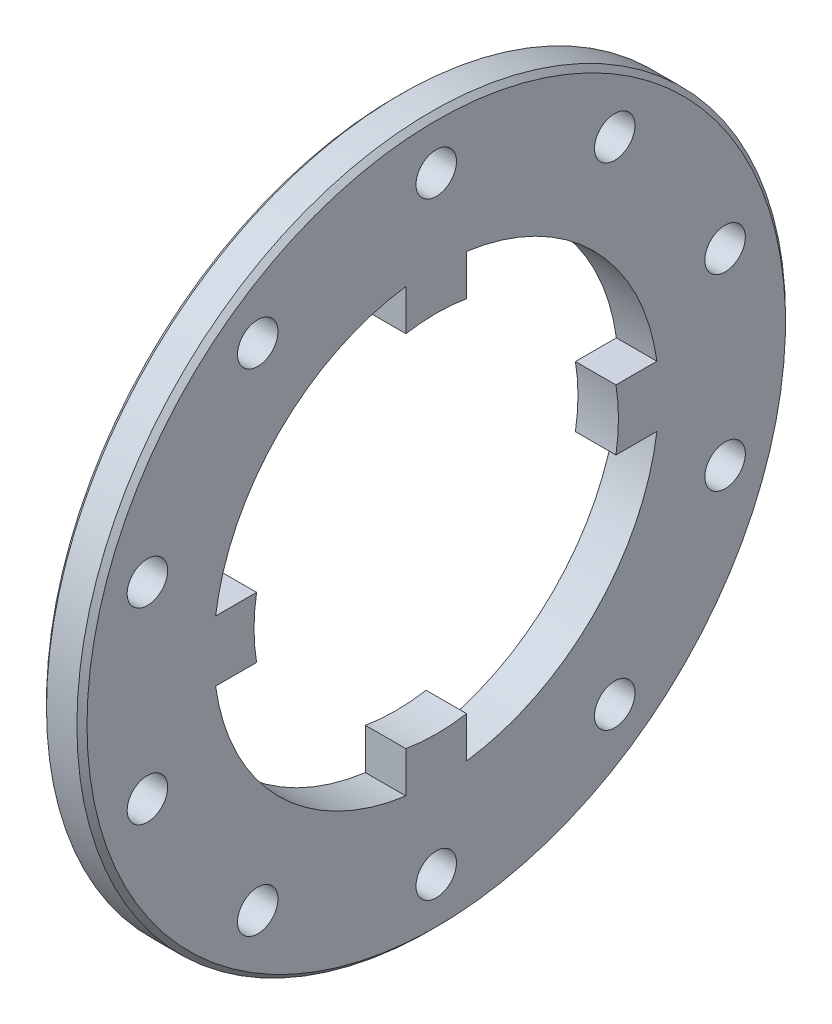
ISO-10303-21;
HEADER;
FILE_DESCRIPTION(('STEP AP214'),'2;1');
FILE_NAME('part.step','',(''),(''),'','','');
FILE_SCHEMA(('AUTOMOTIVE_DESIGN { 1 0 10303 214 1 1 1 1 }'));
ENDSEC;
DATA;
#1=APPLICATION_CONTEXT('core data for automotive mechanical design processes');
#2=APPLICATION_PROTOCOL_DEFINITION('international standard','automotive_design',2000,#1);
#3=PRODUCT_CONTEXT('',#1,'mechanical');
#4=PRODUCT('Part','Part','',(#3));
#5=PRODUCT_RELATED_PRODUCT_CATEGORY('part','',(#4));
#6=PRODUCT_DEFINITION_FORMATION('','',#4);
#7=PRODUCT_DEFINITION_CONTEXT('part definition',#1,'design');
#8=PRODUCT_DEFINITION('design','',#6,#7);
#9=PRODUCT_DEFINITION_SHAPE('','',#8);
#10=(LENGTH_UNIT() NAMED_UNIT(*) SI_UNIT(.MILLI.,.METRE.));
#11=(NAMED_UNIT(*) PLANE_ANGLE_UNIT() SI_UNIT($,.RADIAN.));
#12=(NAMED_UNIT(*) SI_UNIT($,.STERADIAN.) SOLID_ANGLE_UNIT());
#13=UNCERTAINTY_MEASURE_WITH_UNIT(LENGTH_MEASURE(1.E-05),#10,'distance_accuracy_value','');
#14=(GEOMETRIC_REPRESENTATION_CONTEXT(3) GLOBAL_UNCERTAINTY_ASSIGNED_CONTEXT((#13)) GLOBAL_UNIT_ASSIGNED_CONTEXT((#10,
#11,#12)) REPRESENTATION_CONTEXT('',''));
#15=CARTESIAN_POINT('',(0.,0.,0.));
#16=DIRECTION('',(0.,0.,1.));
#17=DIRECTION('',(1.,0.,0.));
#18=AXIS2_PLACEMENT_3D('',#15,#16,#17);
#19=CARTESIAN_POINT('',(0.,0.,0.));
#20=DIRECTION('',(-1.,0.,0.));
#21=DIRECTION('',(0.,0.,1.));
#22=AXIS2_PLACEMENT_3D('',#19,#20,#21);
#23=CYLINDRICAL_SURFACE('',#22,18.);
#24=CARTESIAN_POINT('',(4.,0.,0.));
#25=DIRECTION('',(-1.,0.,0.));
#26=DIRECTION('',(0.,0.,1.));
#27=AXIS2_PLACEMENT_3D('',#24,#25,#26);
#28=CIRCLE('',#27,18.);
#29=CARTESIAN_POINT('',(4.,17.7482393492988,3.));
#30=VERTEX_POINT('',#29);
#31=CARTESIAN_POINT('',(4.,17.7482393492988,-3.));
#32=VERTEX_POINT('',#31);
#33=EDGE_CURVE('E156',#30,#32,#28,.T.);
#34=ORIENTED_EDGE('',*,*,#33,.F.);
#35=DIRECTION('',(-1.,0.,0.));
#36=VECTOR('',#35,1.);
#37=CARTESIAN_POINT('',(0.,17.7482393492988,3.));
#38=LINE('',#37,#36);
#39=CARTESIAN_POINT('',(0.,17.7482393492988,3.));
#40=VERTEX_POINT('',#39);
#41=EDGE_CURVE('E258',#30,#40,#38,.T.);
#42=ORIENTED_EDGE('',*,*,#41,.T.);
#43=CARTESIAN_POINT('',(0.,0.,0.));
#44=DIRECTION('',(-1.,0.,0.));
#45=DIRECTION('',(0.,0.,1.));
#46=AXIS2_PLACEMENT_3D('',#43,#44,#45);
#47=CIRCLE('',#46,18.);
#48=CARTESIAN_POINT('',(0.,17.7482393492988,-3.));
#49=VERTEX_POINT('',#48);
#50=EDGE_CURVE('E265',#40,#49,#47,.T.);
#51=ORIENTED_EDGE('',*,*,#50,.T.);
#52=DIRECTION('',(-1.,0.,0.));
#53=VECTOR('',#52,1.);
#54=CARTESIAN_POINT('',(0.,17.7482393492988,-3.));
#55=LINE('',#54,#53);
#56=EDGE_CURVE('E150',#49,#32,#55,.F.);
#57=ORIENTED_EDGE('',*,*,#56,.T.);
#58=EDGE_LOOP('',(#34,#42,#51,#57));
#59=FACE_BOUND('',#58,.T.);
#60=ADVANCED_FACE('F32',(#59),#23,.F.);
#61=CARTESIAN_POINT('',(0.,-3.,17.7482393492988));
#62=VERTEX_POINT('',#61);
#63=CARTESIAN_POINT('',(0.,3.00000000000001,17.7482393492988));
#64=VERTEX_POINT('',#63);
#65=EDGE_CURVE('E261',#62,#64,#47,.T.);
#66=ORIENTED_EDGE('',*,*,#65,.T.);
#67=DIRECTION('',(-1.,0.,0.));
#68=VECTOR('',#67,1.);
#69=CARTESIAN_POINT('',(0.,3.,17.7482393492988));
#70=LINE('',#69,#68);
#71=CARTESIAN_POINT('',(4.,3.,17.7482393492988));
#72=VERTEX_POINT('',#71);
#73=EDGE_CURVE('E255',#64,#72,#70,.F.);
#74=ORIENTED_EDGE('',*,*,#73,.T.);
#75=CARTESIAN_POINT('',(4.,-3.,17.7482393492988));
#76=VERTEX_POINT('',#75);
#77=EDGE_CURVE('E266',#76,#72,#28,.T.);
#78=ORIENTED_EDGE('',*,*,#77,.F.);
#79=DIRECTION('',(-1.,0.,0.));
#80=VECTOR('',#79,1.);
#81=CARTESIAN_POINT('',(0.,-3.,17.7482393492988));
#82=LINE('',#81,#80);
#83=EDGE_CURVE('E252',#76,#62,#82,.T.);
#84=ORIENTED_EDGE('',*,*,#83,.T.);
#85=EDGE_LOOP('',(#66,#74,#78,#84));
#86=FACE_BOUND('',#85,.T.);
#87=ADVANCED_FACE('F310',(#86),#23,.F.);
#88=CARTESIAN_POINT('',(0.,-17.7482393492988,-3.));
#89=VERTEX_POINT('',#88);
#90=CARTESIAN_POINT('',(0.,-17.7482393492988,3.));
#91=VERTEX_POINT('',#90);
#92=EDGE_CURVE('E264',#89,#91,#47,.T.);
#93=ORIENTED_EDGE('',*,*,#92,.T.);
#94=DIRECTION('',(-1.,0.,0.));
#95=VECTOR('',#94,1.);
#96=CARTESIAN_POINT('',(0.,-17.7482393492988,3.));
#97=LINE('',#96,#95);
#98=CARTESIAN_POINT('',(4.,-17.7482393492988,3.));
#99=VERTEX_POINT('',#98);
#100=EDGE_CURVE('E47',#91,#99,#97,.F.);
#101=ORIENTED_EDGE('',*,*,#100,.T.);
#102=CARTESIAN_POINT('',(4.,-17.7482393492988,-3.));
#103=VERTEX_POINT('',#102);
#104=EDGE_CURVE('E268',#103,#99,#28,.T.);
#105=ORIENTED_EDGE('',*,*,#104,.F.);
#106=DIRECTION('',(-1.,0.,0.));
#107=VECTOR('',#106,1.);
#108=CARTESIAN_POINT('',(0.,-17.7482393492988,-3.));
#109=LINE('',#108,#107);
#110=EDGE_CURVE('E248',#103,#89,#109,.T.);
#111=ORIENTED_EDGE('',*,*,#110,.T.);
#112=EDGE_LOOP('',(#93,#101,#105,#111));
#113=FACE_BOUND('',#112,.T.);
#114=ADVANCED_FACE('F306',(#113),#23,.F.);
#115=CARTESIAN_POINT('',(0.,0.,0.));
#116=DIRECTION('',(-1.,0.,0.));
#117=DIRECTION('',(0.,0.,1.));
#118=AXIS2_PLACEMENT_3D('',#115,#116,#117);
#119=CYLINDRICAL_SURFACE('',#118,35.);
#120=CARTESIAN_POINT('',(0.500000000000009,0.,0.));
#121=DIRECTION('',(1.,0.,0.));
#122=DIRECTION('',(0.,0.,-1.));
#123=AXIS2_PLACEMENT_3D('',#120,#121,#122);
#124=CIRCLE('',#123,35.);
#125=CARTESIAN_POINT('',(0.500000000000009,0.,-35.));
#126=VERTEX_POINT('',#125);
#127=EDGE_CURVE('E40',#126,#126,#124,.T.);
#128=ORIENTED_EDGE('',*,*,#127,.T.);
#129=EDGE_LOOP('',(#128));
#130=FACE_BOUND('',#129,.T.);
#131=CARTESIAN_POINT('',(3.49999999999999,0.,0.));
#132=DIRECTION('',(-1.,0.,0.));
#133=DIRECTION('',(0.,0.,1.));
#134=AXIS2_PLACEMENT_3D('',#131,#132,#133);
#135=CIRCLE('',#134,35.);
#136=CARTESIAN_POINT('',(3.49999999999999,0.,35.));
#137=VERTEX_POINT('',#136);
#138=EDGE_CURVE('E279',#137,#137,#135,.T.);
#139=ORIENTED_EDGE('',*,*,#138,.T.);
#140=EDGE_LOOP('',(#139));
#141=FACE_BOUND('',#140,.T.);
#142=ADVANCED_FACE('F34',(#130,#141),#119,.T.);
#143=CARTESIAN_POINT('',(4.,18.,0.));
#144=DIRECTION('',(-1.,0.,0.));
#145=DIRECTION('',(0.,0.,1.));
#146=AXIS2_PLACEMENT_3D('',#143,#144,#145);
#147=PLANE('',#146);
#148=CARTESIAN_POINT('',(4.,24.2705098312487,-17.6335575687739));
#149=DIRECTION('',(-1.,0.,0.));
#150=DIRECTION('',(0.,0.,1.));
#151=AXIS2_PLACEMENT_3D('',#148,#149,#150);
#152=CIRCLE('',#151,2.);
#153=CARTESIAN_POINT('',(4.,24.2705098312487,-15.6335575687739));
#154=VERTEX_POINT('',#153);
#155=EDGE_CURVE('E325',#154,#154,#152,.T.);
#156=ORIENTED_EDGE('',*,*,#155,.T.);
#157=EDGE_LOOP('',(#156));
#158=FACE_BOUND('',#157,.T.);
#159=CARTESIAN_POINT('',(4.,9.27050983124876,-28.5316954888545));
#160=DIRECTION('',(-1.,0.,0.));
#161=DIRECTION('',(0.,0.,1.));
#162=AXIS2_PLACEMENT_3D('',#159,#160,#161);
#163=CIRCLE('',#162,2.);
#164=CARTESIAN_POINT('',(4.,9.27050983124876,-26.5316954888545));
#165=VERTEX_POINT('',#164);
#166=EDGE_CURVE('E329',#165,#165,#163,.T.);
#167=ORIENTED_EDGE('',*,*,#166,.T.);
#168=EDGE_LOOP('',(#167));
#169=FACE_BOUND('',#168,.T.);
#170=CARTESIAN_POINT('',(4.,-9.27050983124816,-28.5316954888547));
#171=DIRECTION('',(-1.,0.,0.));
#172=DIRECTION('',(0.,0.,1.));
#173=AXIS2_PLACEMENT_3D('',#170,#171,#172);
#174=CIRCLE('',#173,2.);
#175=CARTESIAN_POINT('',(4.,-9.27050983124816,-26.5316954888547));
#176=VERTEX_POINT('',#175);
#177=EDGE_CURVE('E333',#176,#176,#174,.T.);
#178=ORIENTED_EDGE('',*,*,#177,.T.);
#179=EDGE_LOOP('',(#178));
#180=FACE_BOUND('',#179,.T.);
#181=CARTESIAN_POINT('',(4.,-24.2705098312483,-17.6335575687744));
#182=DIRECTION('',(-1.,0.,0.));
#183=DIRECTION('',(0.,0.,1.));
#184=AXIS2_PLACEMENT_3D('',#181,#182,#183);
#185=CIRCLE('',#184,2.);
#186=CARTESIAN_POINT('',(4.,-24.2705098312483,-15.6335575687744));
#187=VERTEX_POINT('',#186);
#188=EDGE_CURVE('E337',#187,#187,#185,.T.);
#189=ORIENTED_EDGE('',*,*,#188,.T.);
#190=EDGE_LOOP('',(#189));
#191=FACE_BOUND('',#190,.T.);
#192=CARTESIAN_POINT('',(4.,-30.,-2.09489001666563E-13));
#193=DIRECTION('',(-1.,0.,0.));
#194=DIRECTION('',(0.,0.,1.));
#195=AXIS2_PLACEMENT_3D('',#192,#193,#194);
#196=CIRCLE('',#195,2.);
#197=CARTESIAN_POINT('',(4.,-30.,1.99999999999979));
#198=VERTEX_POINT('',#197);
#199=EDGE_CURVE('E341',#198,#198,#196,.T.);
#200=ORIENTED_EDGE('',*,*,#199,.T.);
#201=EDGE_LOOP('',(#200));
#202=FACE_BOUND('',#201,.T.);
#203=CARTESIAN_POINT('',(4.,-24.2705098312486,17.6335575687741));
#204=DIRECTION('',(-1.,0.,0.));
#205=DIRECTION('',(0.,0.,1.));
#206=AXIS2_PLACEMENT_3D('',#203,#204,#205);
#207=CIRCLE('',#206,2.);
#208=CARTESIAN_POINT('',(4.,-24.2705098312486,19.6335575687741));
#209=VERTEX_POINT('',#208);
#210=EDGE_CURVE('E345',#209,#209,#207,.T.);
#211=ORIENTED_EDGE('',*,*,#210,.T.);
#212=EDGE_LOOP('',(#211));
#213=FACE_BOUND('',#212,.T.);
#214=CARTESIAN_POINT('',(4.,-9.27050983124856,28.5316954888546));
#215=DIRECTION('',(-1.,0.,0.));
#216=DIRECTION('',(0.,0.,1.));
#217=AXIS2_PLACEMENT_3D('',#214,#215,#216);
#218=CIRCLE('',#217,2.);
#219=CARTESIAN_POINT('',(4.,-9.27050983124856,30.5316954888546));
#220=VERTEX_POINT('',#219);
#221=EDGE_CURVE('E349',#220,#220,#218,.T.);
#222=ORIENTED_EDGE('',*,*,#221,.T.);
#223=EDGE_LOOP('',(#222));
#224=FACE_BOUND('',#223,.T.);
#225=CARTESIAN_POINT('',(4.,9.27050983124835,28.5316954888547));
#226=DIRECTION('',(-1.,0.,0.));
#227=DIRECTION('',(0.,0.,1.));
#228=AXIS2_PLACEMENT_3D('',#225,#226,#227);
#229=CIRCLE('',#228,2.);
#230=CARTESIAN_POINT('',(4.,9.27050983124835,30.5316954888547));
#231=VERTEX_POINT('',#230);
#232=EDGE_CURVE('E353',#231,#231,#229,.T.);
#233=ORIENTED_EDGE('',*,*,#232,.T.);
#234=EDGE_LOOP('',(#233));
#235=FACE_BOUND('',#234,.T.);
#236=CARTESIAN_POINT('',(4.,24.2705098312484,17.6335575687743));
#237=DIRECTION('',(-1.,0.,0.));
#238=DIRECTION('',(0.,0.,1.));
#239=AXIS2_PLACEMENT_3D('',#236,#237,#238);
#240=CIRCLE('',#239,2.);
#241=CARTESIAN_POINT('',(4.,24.2705098312484,19.6335575687743));
#242=VERTEX_POINT('',#241);
#243=EDGE_CURVE('E357',#242,#242,#240,.T.);
#244=ORIENTED_EDGE('',*,*,#243,.T.);
#245=EDGE_LOOP('',(#244));
#246=FACE_BOUND('',#245,.T.);
#247=CARTESIAN_POINT('',(4.,30.,0.));
#248=DIRECTION('',(-1.,0.,0.));
#249=DIRECTION('',(0.,0.,1.));
#250=AXIS2_PLACEMENT_3D('',#247,#248,#249);
#251=CIRCLE('',#250,2.);
#252=CARTESIAN_POINT('',(4.,30.,2.));
#253=VERTEX_POINT('',#252);
#254=EDGE_CURVE('E172',#253,#253,#251,.T.);
#255=ORIENTED_EDGE('',*,*,#254,.T.);
#256=EDGE_LOOP('',(#255));
#257=FACE_BOUND('',#256,.T.);
#258=CARTESIAN_POINT('',(4.,0.,0.));
#259=DIRECTION('',(-1.,0.,0.));
#260=DIRECTION('',(0.,0.,1.));
#261=AXIS2_PLACEMENT_3D('',#258,#259,#260);
#262=CIRCLE('',#261,34.5);
#263=CARTESIAN_POINT('',(4.,0.,34.5));
#264=VERTEX_POINT('',#263);
#265=EDGE_CURVE('E11',#264,#264,#262,.F.);
#266=ORIENTED_EDGE('',*,*,#265,.T.);
#267=EDGE_LOOP('',(#266));
#268=FACE_BOUND('',#267,.T.);
#269=CARTESIAN_POINT('',(4.,0.,0.));
#270=DIRECTION('',(-1.,0.,0.));
#271=DIRECTION('',(0.,0.,1.));
#272=AXIS2_PLACEMENT_3D('',#269,#270,#271);
#273=CIRCLE('',#272,22.);
#274=CARTESIAN_POINT('',(4.,3.,21.7944947177034));
#275=VERTEX_POINT('',#274);
#276=CARTESIAN_POINT('',(4.,21.7944947177034,3.));
#277=VERTEX_POINT('',#276);
#278=EDGE_CURVE('E222',#275,#277,#273,.T.);
#279=ORIENTED_EDGE('',*,*,#278,.T.);
#280=DIRECTION('',(0.,-1.,0.));
#281=VECTOR('',#280,1.);
#282=CARTESIAN_POINT('',(4.,16.,3.));
#283=LINE('',#282,#281);
#284=EDGE_CURVE('E167',#277,#30,#283,.T.);
#285=ORIENTED_EDGE('',*,*,#284,.T.);
#286=ORIENTED_EDGE('',*,*,#33,.T.);
#287=DIRECTION('',(0.,1.,0.));
#288=VECTOR('',#287,1.);
#289=CARTESIAN_POINT('',(4.,16.,-3.));
#290=LINE('',#289,#288);
#291=CARTESIAN_POINT('',(4.,21.7944947177034,-3.));
#292=VERTEX_POINT('',#291);
#293=EDGE_CURVE('E195',#32,#292,#290,.T.);
#294=ORIENTED_EDGE('',*,*,#293,.T.);
#295=CARTESIAN_POINT('',(4.,0.,0.));
#296=DIRECTION('',(-1.,0.,0.));
#297=DIRECTION('',(0.,0.,1.));
#298=AXIS2_PLACEMENT_3D('',#295,#296,#297);
#299=CIRCLE('',#298,22.);
#300=CARTESIAN_POINT('',(4.,3.,-21.7944947177034));
#301=VERTEX_POINT('',#300);
#302=EDGE_CURVE('E164',#292,#301,#299,.T.);
#303=ORIENTED_EDGE('',*,*,#302,.T.);
#304=DIRECTION('',(0.,0.,1.));
#305=VECTOR('',#304,1.);
#306=CARTESIAN_POINT('',(4.,3.,-16.));
#307=LINE('',#306,#305);
#308=CARTESIAN_POINT('',(4.,3.,-17.7482393492988));
#309=VERTEX_POINT('',#308);
#310=EDGE_CURVE('E198',#301,#309,#307,.T.);
#311=ORIENTED_EDGE('',*,*,#310,.T.);
#312=CARTESIAN_POINT('',(4.,-3.,-17.7482393492988));
#313=VERTEX_POINT('',#312);
#314=EDGE_CURVE('E387',#309,#313,#28,.T.);
#315=ORIENTED_EDGE('',*,*,#314,.T.);
#316=DIRECTION('',(0.,0.,-1.));
#317=VECTOR('',#316,1.);
#318=CARTESIAN_POINT('',(4.,-3.00000000000001,-16.));
#319=LINE('',#318,#317);
#320=CARTESIAN_POINT('',(4.,-3.00000000000001,-21.7944947177034));
#321=VERTEX_POINT('',#320);
#322=EDGE_CURVE('E201',#313,#321,#319,.T.);
#323=ORIENTED_EDGE('',*,*,#322,.T.);
#324=CARTESIAN_POINT('',(4.,0.,0.));
#325=DIRECTION('',(-1.,0.,0.));
#326=DIRECTION('',(0.,0.,1.));
#327=AXIS2_PLACEMENT_3D('',#324,#325,#326);
#328=CIRCLE('',#327,22.);
#329=CARTESIAN_POINT('',(4.,-21.7944947177034,-3.));
#330=VERTEX_POINT('',#329);
#331=EDGE_CURVE('E204',#321,#330,#328,.T.);
#332=ORIENTED_EDGE('',*,*,#331,.T.);
#333=DIRECTION('',(0.,1.,0.));
#334=VECTOR('',#333,1.);
#335=CARTESIAN_POINT('',(4.,-16.,-3.));
#336=LINE('',#335,#334);
#337=EDGE_CURVE('E207',#330,#103,#336,.T.);
#338=ORIENTED_EDGE('',*,*,#337,.T.);
#339=ORIENTED_EDGE('',*,*,#104,.T.);
#340=DIRECTION('',(0.,-1.,0.));
#341=VECTOR('',#340,1.);
#342=CARTESIAN_POINT('',(4.,-16.,3.));
#343=LINE('',#342,#341);
#344=CARTESIAN_POINT('',(4.,-21.7944947177034,3.00000000000001));
#345=VERTEX_POINT('',#344);
#346=EDGE_CURVE('E210',#99,#345,#343,.T.);
#347=ORIENTED_EDGE('',*,*,#346,.T.);
#348=CARTESIAN_POINT('',(4.,0.,0.));
#349=DIRECTION('',(-1.,0.,0.));
#350=DIRECTION('',(0.,0.,1.));
#351=AXIS2_PLACEMENT_3D('',#348,#349,#350);
#352=CIRCLE('',#351,22.);
#353=CARTESIAN_POINT('',(4.,-3.,21.7944947177034));
#354=VERTEX_POINT('',#353);
#355=EDGE_CURVE('E213',#345,#354,#352,.T.);
#356=ORIENTED_EDGE('',*,*,#355,.T.);
#357=DIRECTION('',(0.,0.,-1.));
#358=VECTOR('',#357,1.);
#359=CARTESIAN_POINT('',(4.,-3.,16.));
#360=LINE('',#359,#358);
#361=EDGE_CURVE('E216',#354,#76,#360,.T.);
#362=ORIENTED_EDGE('',*,*,#361,.T.);
#363=ORIENTED_EDGE('',*,*,#77,.T.);
#364=DIRECTION('',(0.,0.,1.));
#365=VECTOR('',#364,1.);
#366=CARTESIAN_POINT('',(4.,3.,16.));
#367=LINE('',#366,#365);
#368=EDGE_CURVE('E219',#72,#275,#367,.T.);
#369=ORIENTED_EDGE('',*,*,#368,.T.);
#370=EDGE_LOOP('',(#279,#285,#286,#294,#303,#311,#315,#323,#332,#338,#339,#347,#356,#362,#363,#369));
#371=FACE_BOUND('',#370,.T.);
#372=ADVANCED_FACE('F303',(#158,#169,#180,#191,#202,#213,#224,#235,#246,#257,#268,#371),#147,.F.);
#373=CARTESIAN_POINT('',(0.,3.,-17.7482393492988));
#374=VERTEX_POINT('',#373);
#375=CARTESIAN_POINT('',(0.,-3.,-17.7482393492988));
#376=VERTEX_POINT('',#375);
#377=EDGE_CURVE('E370',#374,#376,#47,.T.);
#378=ORIENTED_EDGE('',*,*,#377,.T.);
#379=DIRECTION('',(-1.,0.,0.));
#380=VECTOR('',#379,1.);
#381=CARTESIAN_POINT('',(0.,-3.00000000000001,-17.7482393492988));
#382=LINE('',#381,#380);
#383=EDGE_CURVE('E55',#376,#313,#382,.F.);
#384=ORIENTED_EDGE('',*,*,#383,.T.);
#385=ORIENTED_EDGE('',*,*,#314,.F.);
#386=DIRECTION('',(-1.,0.,0.));
#387=VECTOR('',#386,1.);
#388=CARTESIAN_POINT('',(0.,3.,-17.7482393492988));
#389=LINE('',#388,#387);
#390=EDGE_CURVE('E244',#309,#374,#389,.T.);
#391=ORIENTED_EDGE('',*,*,#390,.T.);
#392=EDGE_LOOP('',(#378,#384,#385,#391));
#393=FACE_BOUND('',#392,.T.);
#394=ADVANCED_FACE('F295',(#393),#23,.F.);
#395=CARTESIAN_POINT('',(0.,35.,0.));
#396=DIRECTION('',(1.,0.,0.));
#397=DIRECTION('',(0.,0.,-1.));
#398=AXIS2_PLACEMENT_3D('',#395,#396,#397);
#399=PLANE('',#398);
#400=CARTESIAN_POINT('',(0.,24.2705098312487,-17.6335575687739));
#401=DIRECTION('',(-1.,0.,0.));
#402=DIRECTION('',(0.,0.,1.));
#403=AXIS2_PLACEMENT_3D('',#400,#401,#402);
#404=CIRCLE('',#403,2.);
#405=CARTESIAN_POINT('',(0.,24.2705098312487,-15.6335575687739));
#406=VERTEX_POINT('',#405);
#407=EDGE_CURVE('E604',#406,#406,#404,.T.);
#408=ORIENTED_EDGE('',*,*,#407,.F.);
#409=EDGE_LOOP('',(#408));
#410=FACE_BOUND('',#409,.T.);
#411=CARTESIAN_POINT('',(0.,9.27050983124876,-28.5316954888545));
#412=DIRECTION('',(-1.,0.,0.));
#413=DIRECTION('',(0.,0.,1.));
#414=AXIS2_PLACEMENT_3D('',#411,#412,#413);
#415=CIRCLE('',#414,2.);
#416=CARTESIAN_POINT('',(0.,9.27050983124876,-26.5316954888545));
#417=VERTEX_POINT('',#416);
#418=EDGE_CURVE('E606',#417,#417,#415,.T.);
#419=ORIENTED_EDGE('',*,*,#418,.F.);
#420=EDGE_LOOP('',(#419));
#421=FACE_BOUND('',#420,.T.);
#422=CARTESIAN_POINT('',(0.,-9.27050983124816,-28.5316954888547));
#423=DIRECTION('',(-1.,0.,0.));
#424=DIRECTION('',(0.,0.,1.));
#425=AXIS2_PLACEMENT_3D('',#422,#423,#424);
#426=CIRCLE('',#425,2.);
#427=CARTESIAN_POINT('',(0.,-9.27050983124816,-26.5316954888547));
#428=VERTEX_POINT('',#427);
#429=EDGE_CURVE('E612',#428,#428,#426,.T.);
#430=ORIENTED_EDGE('',*,*,#429,.F.);
#431=EDGE_LOOP('',(#430));
#432=FACE_BOUND('',#431,.T.);
#433=CARTESIAN_POINT('',(0.,-24.2705098312483,-17.6335575687744));
#434=DIRECTION('',(-1.,0.,0.));
#435=DIRECTION('',(0.,0.,1.));
#436=AXIS2_PLACEMENT_3D('',#433,#434,#435);
#437=CIRCLE('',#436,2.);
#438=CARTESIAN_POINT('',(0.,-24.2705098312483,-15.6335575687744));
#439=VERTEX_POINT('',#438);
#440=EDGE_CURVE('E616',#439,#439,#437,.T.);
#441=ORIENTED_EDGE('',*,*,#440,.F.);
#442=EDGE_LOOP('',(#441));
#443=FACE_BOUND('',#442,.T.);
#444=CARTESIAN_POINT('',(0.,-30.,-2.09489001666563E-13));
#445=DIRECTION('',(-1.,0.,0.));
#446=DIRECTION('',(0.,0.,1.));
#447=AXIS2_PLACEMENT_3D('',#444,#445,#446);
#448=CIRCLE('',#447,2.);
#449=CARTESIAN_POINT('',(0.,-30.,1.99999999999979));
#450=VERTEX_POINT('',#449);
#451=EDGE_CURVE('E620',#450,#450,#448,.T.);
#452=ORIENTED_EDGE('',*,*,#451,.F.);
#453=EDGE_LOOP('',(#452));
#454=FACE_BOUND('',#453,.T.);
#455=CARTESIAN_POINT('',(0.,-24.2705098312486,17.6335575687741));
#456=DIRECTION('',(-1.,0.,0.));
#457=DIRECTION('',(0.,0.,1.));
#458=AXIS2_PLACEMENT_3D('',#455,#456,#457);
#459=CIRCLE('',#458,2.);
#460=CARTESIAN_POINT('',(0.,-24.2705098312486,19.6335575687741));
#461=VERTEX_POINT('',#460);
#462=EDGE_CURVE('E624',#461,#461,#459,.T.);
#463=ORIENTED_EDGE('',*,*,#462,.F.);
#464=EDGE_LOOP('',(#463));
#465=FACE_BOUND('',#464,.T.);
#466=CARTESIAN_POINT('',(0.,-9.27050983124856,28.5316954888546));
#467=DIRECTION('',(-1.,0.,0.));
#468=DIRECTION('',(0.,0.,1.));
#469=AXIS2_PLACEMENT_3D('',#466,#467,#468);
#470=CIRCLE('',#469,2.);
#471=CARTESIAN_POINT('',(0.,-9.27050983124856,30.5316954888546));
#472=VERTEX_POINT('',#471);
#473=EDGE_CURVE('E628',#472,#472,#470,.T.);
#474=ORIENTED_EDGE('',*,*,#473,.F.);
#475=EDGE_LOOP('',(#474));
#476=FACE_BOUND('',#475,.T.);
#477=CARTESIAN_POINT('',(0.,9.27050983124835,28.5316954888547));
#478=DIRECTION('',(-1.,0.,0.));
#479=DIRECTION('',(0.,0.,1.));
#480=AXIS2_PLACEMENT_3D('',#477,#478,#479);
#481=CIRCLE('',#480,2.);
#482=CARTESIAN_POINT('',(0.,9.27050983124835,30.5316954888547));
#483=VERTEX_POINT('',#482);
#484=EDGE_CURVE('E632',#483,#483,#481,.T.);
#485=ORIENTED_EDGE('',*,*,#484,.F.);
#486=EDGE_LOOP('',(#485));
#487=FACE_BOUND('',#486,.T.);
#488=CARTESIAN_POINT('',(0.,24.2705098312484,17.6335575687743));
#489=DIRECTION('',(-1.,0.,0.));
#490=DIRECTION('',(0.,0.,1.));
#491=AXIS2_PLACEMENT_3D('',#488,#489,#490);
#492=CIRCLE('',#491,2.);
#493=CARTESIAN_POINT('',(0.,24.2705098312484,19.6335575687743));
#494=VERTEX_POINT('',#493);
#495=EDGE_CURVE('E636',#494,#494,#492,.T.);
#496=ORIENTED_EDGE('',*,*,#495,.F.);
#497=EDGE_LOOP('',(#496));
#498=FACE_BOUND('',#497,.T.);
#499=CARTESIAN_POINT('',(0.,30.,0.));
#500=DIRECTION('',(-1.,0.,0.));
#501=DIRECTION('',(0.,0.,1.));
#502=AXIS2_PLACEMENT_3D('',#499,#500,#501);
#503=CIRCLE('',#502,2.);
#504=CARTESIAN_POINT('',(0.,30.,2.));
#505=VERTEX_POINT('',#504);
#506=EDGE_CURVE('E177',#505,#505,#503,.T.);
#507=ORIENTED_EDGE('',*,*,#506,.F.);
#508=EDGE_LOOP('',(#507));
#509=FACE_BOUND('',#508,.T.);
#510=CARTESIAN_POINT('',(0.,0.,0.));
#511=DIRECTION('',(1.,0.,0.));
#512=DIRECTION('',(0.,0.,-1.));
#513=AXIS2_PLACEMENT_3D('',#510,#511,#512);
#514=CIRCLE('',#513,34.5);
#515=CARTESIAN_POINT('',(0.,0.,-34.5));
#516=VERTEX_POINT('',#515);
#517=EDGE_CURVE('E276',#516,#516,#514,.F.);
#518=ORIENTED_EDGE('',*,*,#517,.T.);
#519=EDGE_LOOP('',(#518));
#520=FACE_BOUND('',#519,.T.);
#521=ORIENTED_EDGE('',*,*,#50,.F.);
#522=DIRECTION('',(0.,-1.,0.));
#523=VECTOR('',#522,1.);
#524=CARTESIAN_POINT('',(0.,16.,3.));
#525=LINE('',#524,#523);
#526=CARTESIAN_POINT('',(0.,21.7944947177034,3.));
#527=VERTEX_POINT('',#526);
#528=EDGE_CURVE('E193',#527,#40,#525,.T.);
#529=ORIENTED_EDGE('',*,*,#528,.F.);
#530=CARTESIAN_POINT('',(0.,0.,0.));
#531=DIRECTION('',(-1.,0.,0.));
#532=DIRECTION('',(0.,0.,1.));
#533=AXIS2_PLACEMENT_3D('',#530,#531,#532);
#534=CIRCLE('',#533,22.);
#535=CARTESIAN_POINT('',(0.,3.,21.7944947177034));
#536=VERTEX_POINT('',#535);
#537=EDGE_CURVE('E190',#536,#527,#534,.T.);
#538=ORIENTED_EDGE('',*,*,#537,.F.);
#539=DIRECTION('',(0.,0.,-1.));
#540=VECTOR('',#539,1.);
#541=CARTESIAN_POINT('',(0.,3.,0.));
#542=LINE('',#541,#540);
#543=EDGE_CURVE('E273',#536,#64,#542,.T.);
#544=ORIENTED_EDGE('',*,*,#543,.T.);
#545=ORIENTED_EDGE('',*,*,#65,.F.);
#546=DIRECTION('',(0.,0.,-1.));
#547=VECTOR('',#546,1.);
#548=CARTESIAN_POINT('',(0.,-3.,16.));
#549=LINE('',#548,#547);
#550=CARTESIAN_POINT('',(0.,-3.,21.7944947177034));
#551=VERTEX_POINT('',#550);
#552=EDGE_CURVE('E188',#551,#62,#549,.T.);
#553=ORIENTED_EDGE('',*,*,#552,.F.);
#554=CARTESIAN_POINT('',(0.,0.,0.));
#555=DIRECTION('',(-1.,0.,0.));
#556=DIRECTION('',(0.,0.,1.));
#557=AXIS2_PLACEMENT_3D('',#554,#555,#556);
#558=CIRCLE('',#557,22.);
#559=CARTESIAN_POINT('',(0.,-21.7944947177034,3.00000000000001));
#560=VERTEX_POINT('',#559);
#561=EDGE_CURVE('E185',#560,#551,#558,.T.);
#562=ORIENTED_EDGE('',*,*,#561,.F.);
#563=DIRECTION('',(0.,1.,0.));
#564=VECTOR('',#563,1.);
#565=CARTESIAN_POINT('',(0.,35.,2.99999999999999));
#566=LINE('',#565,#564);
#567=EDGE_CURVE('E271',#560,#91,#566,.T.);
#568=ORIENTED_EDGE('',*,*,#567,.T.);
#569=ORIENTED_EDGE('',*,*,#92,.F.);
#570=DIRECTION('',(0.,1.,0.));
#571=VECTOR('',#570,1.);
#572=CARTESIAN_POINT('',(0.,-16.,-3.));
#573=LINE('',#572,#571);
#574=CARTESIAN_POINT('',(0.,-21.7944947177034,-3.));
#575=VERTEX_POINT('',#574);
#576=EDGE_CURVE('E183',#575,#89,#573,.T.);
#577=ORIENTED_EDGE('',*,*,#576,.F.);
#578=CARTESIAN_POINT('',(0.,0.,0.));
#579=DIRECTION('',(-1.,0.,0.));
#580=DIRECTION('',(0.,0.,1.));
#581=AXIS2_PLACEMENT_3D('',#578,#579,#580);
#582=CIRCLE('',#581,22.);
#583=CARTESIAN_POINT('',(0.,-3.00000000000001,-21.7944947177034));
#584=VERTEX_POINT('',#583);
#585=EDGE_CURVE('E174',#584,#575,#582,.T.);
#586=ORIENTED_EDGE('',*,*,#585,.F.);
#587=DIRECTION('',(0.,0.,1.));
#588=VECTOR('',#587,1.);
#589=CARTESIAN_POINT('',(0.,-3.,0.));
#590=LINE('',#589,#588);
#591=EDGE_CURVE('E155',#584,#376,#590,.T.);
#592=ORIENTED_EDGE('',*,*,#591,.T.);
#593=ORIENTED_EDGE('',*,*,#377,.F.);
#594=DIRECTION('',(0.,0.,1.));
#595=VECTOR('',#594,1.);
#596=CARTESIAN_POINT('',(0.,3.,-16.));
#597=LINE('',#596,#595);
#598=CARTESIAN_POINT('',(0.,3.,-21.7944947177034));
#599=VERTEX_POINT('',#598);
#600=EDGE_CURVE('E171',#599,#374,#597,.T.);
#601=ORIENTED_EDGE('',*,*,#600,.F.);
#602=CARTESIAN_POINT('',(0.,0.,0.));
#603=DIRECTION('',(-1.,0.,0.));
#604=DIRECTION('',(0.,0.,1.));
#605=AXIS2_PLACEMENT_3D('',#602,#603,#604);
#606=CIRCLE('',#605,22.);
#607=CARTESIAN_POINT('',(0.,21.7944947177034,-3.));
#608=VERTEX_POINT('',#607);
#609=EDGE_CURVE('E161',#608,#599,#606,.T.);
#610=ORIENTED_EDGE('',*,*,#609,.F.);
#611=DIRECTION('',(0.,-1.,0.));
#612=VECTOR('',#611,1.);
#613=CARTESIAN_POINT('',(0.,35.,-3.));
#614=LINE('',#613,#612);
#615=EDGE_CURVE('E144',#608,#49,#614,.T.);
#616=ORIENTED_EDGE('',*,*,#615,.T.);
#617=EDGE_LOOP('',(#521,#529,#538,#544,#545,#553,#562,#568,#569,#577,#586,#592,#593,#601,#610,#616));
#618=FACE_BOUND('',#617,.T.);
#619=ADVANCED_FACE('F169',(#410,#421,#432,#443,#454,#465,#476,#487,#498,#509,#520,#618),#399,.F.);
#620=CARTESIAN_POINT('',(4.,16.,-3.));
#621=DIRECTION('',(0.,0.,1.));
#622=DIRECTION('',(1.,0.,0.));
#623=AXIS2_PLACEMENT_3D('',#620,#621,#622);
#624=PLANE('',#623);
#625=ORIENTED_EDGE('',*,*,#615,.F.);
#626=DIRECTION('',(-1.,0.,0.));
#627=VECTOR('',#626,1.);
#628=CARTESIAN_POINT('',(4.,21.7944947177034,-3.));
#629=LINE('',#628,#627);
#630=EDGE_CURVE('E147',#292,#608,#629,.T.);
#631=ORIENTED_EDGE('',*,*,#630,.F.);
#632=ORIENTED_EDGE('',*,*,#293,.F.);
#633=ORIENTED_EDGE('',*,*,#56,.F.);
#634=EDGE_LOOP('',(#625,#631,#632,#633));
#635=FACE_BOUND('',#634,.T.);
#636=ADVANCED_FACE('F146',(#635),#624,.F.);
#637=CARTESIAN_POINT('',(4.,0.,0.));
#638=DIRECTION('',(-1.,0.,0.));
#639=DIRECTION('',(0.,0.,1.));
#640=AXIS2_PLACEMENT_3D('',#637,#638,#639);
#641=CYLINDRICAL_SURFACE('',#640,22.);
#642=ORIENTED_EDGE('',*,*,#609,.T.);
#643=DIRECTION('',(-1.,0.,0.));
#644=VECTOR('',#643,1.);
#645=CARTESIAN_POINT('',(4.,3.,-21.7944947177034));
#646=LINE('',#645,#644);
#647=EDGE_CURVE('E166',#301,#599,#646,.T.);
#648=ORIENTED_EDGE('',*,*,#647,.F.);
#649=ORIENTED_EDGE('',*,*,#302,.F.);
#650=ORIENTED_EDGE('',*,*,#630,.T.);
#651=EDGE_LOOP('',(#642,#648,#649,#650));
#652=FACE_BOUND('',#651,.T.);
#653=ADVANCED_FACE('F160',(#652),#641,.F.);
#654=CARTESIAN_POINT('',(4.,3.,-16.));
#655=DIRECTION('',(0.,-1.,0.));
#656=DIRECTION('',(0.,0.,-1.));
#657=AXIS2_PLACEMENT_3D('',#654,#655,#656);
#658=PLANE('',#657);
#659=ORIENTED_EDGE('',*,*,#310,.F.);
#660=ORIENTED_EDGE('',*,*,#647,.T.);
#661=ORIENTED_EDGE('',*,*,#600,.T.);
#662=ORIENTED_EDGE('',*,*,#390,.F.);
#663=EDGE_LOOP('',(#659,#660,#661,#662));
#664=FACE_BOUND('',#663,.T.);
#665=ADVANCED_FACE('F410',(#664),#658,.F.);
#666=CARTESIAN_POINT('',(4.,-3.00000000000001,-16.));
#667=DIRECTION('',(0.,1.,0.));
#668=DIRECTION('',(0.,0.,1.));
#669=AXIS2_PLACEMENT_3D('',#666,#667,#668);
#670=PLANE('',#669);
#671=ORIENTED_EDGE('',*,*,#591,.F.);
#672=DIRECTION('',(-1.,0.,0.));
#673=VECTOR('',#672,1.);
#674=CARTESIAN_POINT('',(4.,-3.00000000000001,-21.7944947177034));
#675=LINE('',#674,#673);
#676=EDGE_CURVE('E239',#321,#584,#675,.T.);
#677=ORIENTED_EDGE('',*,*,#676,.F.);
#678=ORIENTED_EDGE('',*,*,#322,.F.);
#679=ORIENTED_EDGE('',*,*,#383,.F.);
#680=EDGE_LOOP('',(#671,#677,#678,#679));
#681=FACE_BOUND('',#680,.T.);
#682=ADVANCED_FACE('F392',(#681),#670,.F.);
#683=CARTESIAN_POINT('',(4.,0.,0.));
#684=DIRECTION('',(-1.,0.,0.));
#685=DIRECTION('',(0.,0.,1.));
#686=AXIS2_PLACEMENT_3D('',#683,#684,#685);
#687=CYLINDRICAL_SURFACE('',#686,22.);
#688=ORIENTED_EDGE('',*,*,#585,.T.);
#689=DIRECTION('',(-1.,0.,0.));
#690=VECTOR('',#689,1.);
#691=CARTESIAN_POINT('',(4.,-21.7944947177034,-3.));
#692=LINE('',#691,#690);
#693=EDGE_CURVE('E237',#330,#575,#692,.T.);
#694=ORIENTED_EDGE('',*,*,#693,.F.);
#695=ORIENTED_EDGE('',*,*,#331,.F.);
#696=ORIENTED_EDGE('',*,*,#676,.T.);
#697=EDGE_LOOP('',(#688,#694,#695,#696));
#698=FACE_BOUND('',#697,.T.);
#699=ADVANCED_FACE('F395',(#698),#687,.F.);
#700=CARTESIAN_POINT('',(4.,-16.,-3.));
#701=DIRECTION('',(0.,0.,1.));
#702=DIRECTION('',(0.,-1.,0.));
#703=AXIS2_PLACEMENT_3D('',#700,#701,#702);
#704=PLANE('',#703);
#705=ORIENTED_EDGE('',*,*,#337,.F.);
#706=ORIENTED_EDGE('',*,*,#693,.T.);
#707=ORIENTED_EDGE('',*,*,#576,.T.);
#708=ORIENTED_EDGE('',*,*,#110,.F.);
#709=EDGE_LOOP('',(#705,#706,#707,#708));
#710=FACE_BOUND('',#709,.T.);
#711=ADVANCED_FACE('F397',(#710),#704,.F.);
#712=CARTESIAN_POINT('',(4.,-16.,3.));
#713=DIRECTION('',(0.,0.,-1.));
#714=DIRECTION('',(0.,1.,0.));
#715=AXIS2_PLACEMENT_3D('',#712,#713,#714);
#716=PLANE('',#715);
#717=ORIENTED_EDGE('',*,*,#567,.F.);
#718=DIRECTION('',(-1.,0.,0.));
#719=VECTOR('',#718,1.);
#720=CARTESIAN_POINT('',(4.,-21.7944947177034,3.00000000000001));
#721=LINE('',#720,#719);
#722=EDGE_CURVE('E234',#345,#560,#721,.T.);
#723=ORIENTED_EDGE('',*,*,#722,.F.);
#724=ORIENTED_EDGE('',*,*,#346,.F.);
#725=ORIENTED_EDGE('',*,*,#100,.F.);
#726=EDGE_LOOP('',(#717,#723,#724,#725));
#727=FACE_BOUND('',#726,.T.);
#728=ADVANCED_FACE('F381',(#727),#716,.F.);
#729=CARTESIAN_POINT('',(4.,0.,0.));
#730=DIRECTION('',(-1.,0.,0.));
#731=DIRECTION('',(0.,0.,1.));
#732=AXIS2_PLACEMENT_3D('',#729,#730,#731);
#733=CYLINDRICAL_SURFACE('',#732,22.);
#734=ORIENTED_EDGE('',*,*,#561,.T.);
#735=DIRECTION('',(-1.,0.,0.));
#736=VECTOR('',#735,1.);
#737=CARTESIAN_POINT('',(4.,-3.,21.7944947177034));
#738=LINE('',#737,#736);
#739=EDGE_CURVE('E232',#354,#551,#738,.T.);
#740=ORIENTED_EDGE('',*,*,#739,.F.);
#741=ORIENTED_EDGE('',*,*,#355,.F.);
#742=ORIENTED_EDGE('',*,*,#722,.T.);
#743=EDGE_LOOP('',(#734,#740,#741,#742));
#744=FACE_BOUND('',#743,.T.);
#745=ADVANCED_FACE('F384',(#744),#733,.F.);
#746=CARTESIAN_POINT('',(4.,-3.,16.));
#747=DIRECTION('',(0.,1.,0.));
#748=DIRECTION('',(0.,0.,1.));
#749=AXIS2_PLACEMENT_3D('',#746,#747,#748);
#750=PLANE('',#749);
#751=ORIENTED_EDGE('',*,*,#361,.F.);
#752=ORIENTED_EDGE('',*,*,#739,.T.);
#753=ORIENTED_EDGE('',*,*,#552,.T.);
#754=ORIENTED_EDGE('',*,*,#83,.F.);
#755=EDGE_LOOP('',(#751,#752,#753,#754));
#756=FACE_BOUND('',#755,.T.);
#757=ADVANCED_FACE('F449',(#756),#750,.F.);
#758=CARTESIAN_POINT('',(4.,16.,3.));
#759=DIRECTION('',(0.,0.,-1.));
#760=DIRECTION('',(-1.,0.,0.));
#761=AXIS2_PLACEMENT_3D('',#758,#759,#760);
#762=PLANE('',#761);
#763=ORIENTED_EDGE('',*,*,#284,.F.);
#764=DIRECTION('',(-1.,0.,0.));
#765=VECTOR('',#764,1.);
#766=CARTESIAN_POINT('',(4.,21.7944947177034,3.));
#767=LINE('',#766,#765);
#768=EDGE_CURVE('E227',#277,#527,#767,.T.);
#769=ORIENTED_EDGE('',*,*,#768,.T.);
#770=ORIENTED_EDGE('',*,*,#528,.T.);
#771=ORIENTED_EDGE('',*,*,#41,.F.);
#772=EDGE_LOOP('',(#763,#769,#770,#771));
#773=FACE_BOUND('',#772,.T.);
#774=ADVANCED_FACE('F369',(#773),#762,.F.);
#775=CARTESIAN_POINT('',(4.,3.,16.));
#776=DIRECTION('',(0.,-1.,0.));
#777=DIRECTION('',(0.,0.,-1.));
#778=AXIS2_PLACEMENT_3D('',#775,#776,#777);
#779=PLANE('',#778);
#780=ORIENTED_EDGE('',*,*,#543,.F.);
#781=DIRECTION('',(-1.,0.,0.));
#782=VECTOR('',#781,1.);
#783=CARTESIAN_POINT('',(4.,3.,21.7944947177034));
#784=LINE('',#783,#782);
#785=EDGE_CURVE('E229',#275,#536,#784,.T.);
#786=ORIENTED_EDGE('',*,*,#785,.F.);
#787=ORIENTED_EDGE('',*,*,#368,.F.);
#788=ORIENTED_EDGE('',*,*,#73,.F.);
#789=EDGE_LOOP('',(#780,#786,#787,#788));
#790=FACE_BOUND('',#789,.T.);
#791=ADVANCED_FACE('F466',(#790),#779,.F.);
#792=CARTESIAN_POINT('',(4.,0.,0.));
#793=DIRECTION('',(-1.,0.,0.));
#794=DIRECTION('',(0.,0.,1.));
#795=AXIS2_PLACEMENT_3D('',#792,#793,#794);
#796=CYLINDRICAL_SURFACE('',#795,22.);
#797=ORIENTED_EDGE('',*,*,#537,.T.);
#798=ORIENTED_EDGE('',*,*,#768,.F.);
#799=ORIENTED_EDGE('',*,*,#278,.F.);
#800=ORIENTED_EDGE('',*,*,#785,.T.);
#801=EDGE_LOOP('',(#797,#798,#799,#800));
#802=FACE_BOUND('',#801,.T.);
#803=ADVANCED_FACE('F290',(#802),#796,.F.);
#804=CARTESIAN_POINT('',(0.,0.,0.));
#805=DIRECTION('',(1.,0.,0.));
#806=DIRECTION('',(0.,0.,-1.));
#807=AXIS2_PLACEMENT_3D('',#804,#805,#806);
#808=CONICAL_SURFACE('',#807,34.5,0.78539816339744);
#809=ORIENTED_EDGE('',*,*,#127,.F.);
#810=EDGE_LOOP('',(#809));
#811=FACE_BOUND('',#810,.T.);
#812=ORIENTED_EDGE('',*,*,#517,.F.);
#813=EDGE_LOOP('',(#812));
#814=FACE_BOUND('',#813,.T.);
#815=ADVANCED_FACE('F286',(#811,#814),#808,.T.);
#816=CARTESIAN_POINT('',(3.49999999999999,0.,0.));
#817=DIRECTION('',(-1.,0.,0.));
#818=DIRECTION('',(0.,0.,1.));
#819=AXIS2_PLACEMENT_3D('',#816,#817,#818);
#820=CONICAL_SURFACE('',#819,35.,0.78539816339744);
#821=ORIENTED_EDGE('',*,*,#265,.F.);
#822=EDGE_LOOP('',(#821));
#823=FACE_BOUND('',#822,.T.);
#824=ORIENTED_EDGE('',*,*,#138,.F.);
#825=EDGE_LOOP('',(#824));
#826=FACE_BOUND('',#825,.T.);
#827=ADVANCED_FACE('F289',(#823,#826),#820,.T.);
#828=CARTESIAN_POINT('',(4.,30.,0.));
#829=DIRECTION('',(-1.,0.,0.));
#830=DIRECTION('',(0.,0.,1.));
#831=AXIS2_PLACEMENT_3D('',#828,#829,#830);
#832=CYLINDRICAL_SURFACE('',#831,2.);
#833=ORIENTED_EDGE('',*,*,#254,.F.);
#834=EDGE_LOOP('',(#833));
#835=FACE_BOUND('',#834,.T.);
#836=ORIENTED_EDGE('',*,*,#506,.T.);
#837=EDGE_LOOP('',(#836));
#838=FACE_BOUND('',#837,.T.);
#839=ADVANCED_FACE('F498',(#835,#838),#832,.F.);
#840=CARTESIAN_POINT('',(4.,24.2705098312484,17.6335575687743));
#841=DIRECTION('',(-1.,0.,0.));
#842=DIRECTION('',(0.,0.,1.));
#843=AXIS2_PLACEMENT_3D('',#840,#841,#842);
#844=CYLINDRICAL_SURFACE('',#843,2.);
#845=ORIENTED_EDGE('',*,*,#243,.F.);
#846=EDGE_LOOP('',(#845));
#847=FACE_BOUND('',#846,.T.);
#848=ORIENTED_EDGE('',*,*,#495,.T.);
#849=EDGE_LOOP('',(#848));
#850=FACE_BOUND('',#849,.T.);
#851=ADVANCED_FACE('F508',(#847,#850),#844,.F.);
#852=CARTESIAN_POINT('',(4.,9.27050983124835,28.5316954888547));
#853=DIRECTION('',(-1.,0.,0.));
#854=DIRECTION('',(0.,0.,1.));
#855=AXIS2_PLACEMENT_3D('',#852,#853,#854);
#856=CYLINDRICAL_SURFACE('',#855,2.);
#857=ORIENTED_EDGE('',*,*,#232,.F.);
#858=EDGE_LOOP('',(#857));
#859=FACE_BOUND('',#858,.T.);
#860=ORIENTED_EDGE('',*,*,#484,.T.);
#861=EDGE_LOOP('',(#860));
#862=FACE_BOUND('',#861,.T.);
#863=ADVANCED_FACE('F518',(#859,#862),#856,.F.);
#864=CARTESIAN_POINT('',(4.,-9.27050983124856,28.5316954888546));
#865=DIRECTION('',(-1.,0.,0.));
#866=DIRECTION('',(0.,0.,1.));
#867=AXIS2_PLACEMENT_3D('',#864,#865,#866);
#868=CYLINDRICAL_SURFACE('',#867,2.);
#869=ORIENTED_EDGE('',*,*,#221,.F.);
#870=EDGE_LOOP('',(#869));
#871=FACE_BOUND('',#870,.T.);
#872=ORIENTED_EDGE('',*,*,#473,.T.);
#873=EDGE_LOOP('',(#872));
#874=FACE_BOUND('',#873,.T.);
#875=ADVANCED_FACE('F528',(#871,#874),#868,.F.);
#876=CARTESIAN_POINT('',(4.,-24.2705098312486,17.6335575687741));
#877=DIRECTION('',(-1.,0.,0.));
#878=DIRECTION('',(0.,0.,1.));
#879=AXIS2_PLACEMENT_3D('',#876,#877,#878);
#880=CYLINDRICAL_SURFACE('',#879,2.);
#881=ORIENTED_EDGE('',*,*,#210,.F.);
#882=EDGE_LOOP('',(#881));
#883=FACE_BOUND('',#882,.T.);
#884=ORIENTED_EDGE('',*,*,#462,.T.);
#885=EDGE_LOOP('',(#884));
#886=FACE_BOUND('',#885,.T.);
#887=ADVANCED_FACE('F538',(#883,#886),#880,.F.);
#888=CARTESIAN_POINT('',(4.,-30.,-2.09489001666563E-13));
#889=DIRECTION('',(-1.,0.,0.));
#890=DIRECTION('',(0.,0.,1.));
#891=AXIS2_PLACEMENT_3D('',#888,#889,#890);
#892=CYLINDRICAL_SURFACE('',#891,2.);
#893=ORIENTED_EDGE('',*,*,#199,.F.);
#894=EDGE_LOOP('',(#893));
#895=FACE_BOUND('',#894,.T.);
#896=ORIENTED_EDGE('',*,*,#451,.T.);
#897=EDGE_LOOP('',(#896));
#898=FACE_BOUND('',#897,.T.);
#899=ADVANCED_FACE('F548',(#895,#898),#892,.F.);
#900=CARTESIAN_POINT('',(4.,-24.2705098312483,-17.6335575687744));
#901=DIRECTION('',(-1.,0.,0.));
#902=DIRECTION('',(0.,0.,1.));
#903=AXIS2_PLACEMENT_3D('',#900,#901,#902);
#904=CYLINDRICAL_SURFACE('',#903,2.);
#905=ORIENTED_EDGE('',*,*,#188,.F.);
#906=EDGE_LOOP('',(#905));
#907=FACE_BOUND('',#906,.T.);
#908=ORIENTED_EDGE('',*,*,#440,.T.);
#909=EDGE_LOOP('',(#908));
#910=FACE_BOUND('',#909,.T.);
#911=ADVANCED_FACE('F558',(#907,#910),#904,.F.);
#912=CARTESIAN_POINT('',(4.,-9.27050983124816,-28.5316954888547));
#913=DIRECTION('',(-1.,0.,0.));
#914=DIRECTION('',(0.,0.,1.));
#915=AXIS2_PLACEMENT_3D('',#912,#913,#914);
#916=CYLINDRICAL_SURFACE('',#915,2.);
#917=ORIENTED_EDGE('',*,*,#177,.F.);
#918=EDGE_LOOP('',(#917));
#919=FACE_BOUND('',#918,.T.);
#920=ORIENTED_EDGE('',*,*,#429,.T.);
#921=EDGE_LOOP('',(#920));
#922=FACE_BOUND('',#921,.T.);
#923=ADVANCED_FACE('F568',(#919,#922),#916,.F.);
#924=CARTESIAN_POINT('',(4.,9.27050983124876,-28.5316954888545));
#925=DIRECTION('',(-1.,0.,0.));
#926=DIRECTION('',(0.,0.,1.));
#927=AXIS2_PLACEMENT_3D('',#924,#925,#926);
#928=CYLINDRICAL_SURFACE('',#927,2.);
#929=ORIENTED_EDGE('',*,*,#166,.F.);
#930=EDGE_LOOP('',(#929));
#931=FACE_BOUND('',#930,.T.);
#932=ORIENTED_EDGE('',*,*,#418,.T.);
#933=EDGE_LOOP('',(#932));
#934=FACE_BOUND('',#933,.T.);
#935=ADVANCED_FACE('F578',(#931,#934),#928,.F.);
#936=CARTESIAN_POINT('',(4.,24.2705098312487,-17.6335575687739));
#937=DIRECTION('',(-1.,0.,0.));
#938=DIRECTION('',(0.,0.,1.));
#939=AXIS2_PLACEMENT_3D('',#936,#937,#938);
#940=CYLINDRICAL_SURFACE('',#939,2.);
#941=ORIENTED_EDGE('',*,*,#155,.F.);
#942=EDGE_LOOP('',(#941));
#943=FACE_BOUND('',#942,.T.);
#944=ORIENTED_EDGE('',*,*,#407,.T.);
#945=EDGE_LOOP('',(#944));
#946=FACE_BOUND('',#945,.T.);
#947=ADVANCED_FACE('F588',(#943,#946),#940,.F.);
#948=CLOSED_SHELL('',(#60,#87,#114,#142,#372,#394,#619,#636,#653,#665,#682,#699,#711,#728,#745,
#757,#774,#791,#803,#815,#827,#839,#851,#863,#875,#887,#899,#911,#923,#935,#947));
#949=MANIFOLD_SOLID_BREP('B2',#948);
#950=ADVANCED_BREP_SHAPE_REPRESENTATION('',(#18,#949),#14);
#951=SHAPE_DEFINITION_REPRESENTATION(#9,#950);
ENDSEC;
END-ISO-10303-21;
